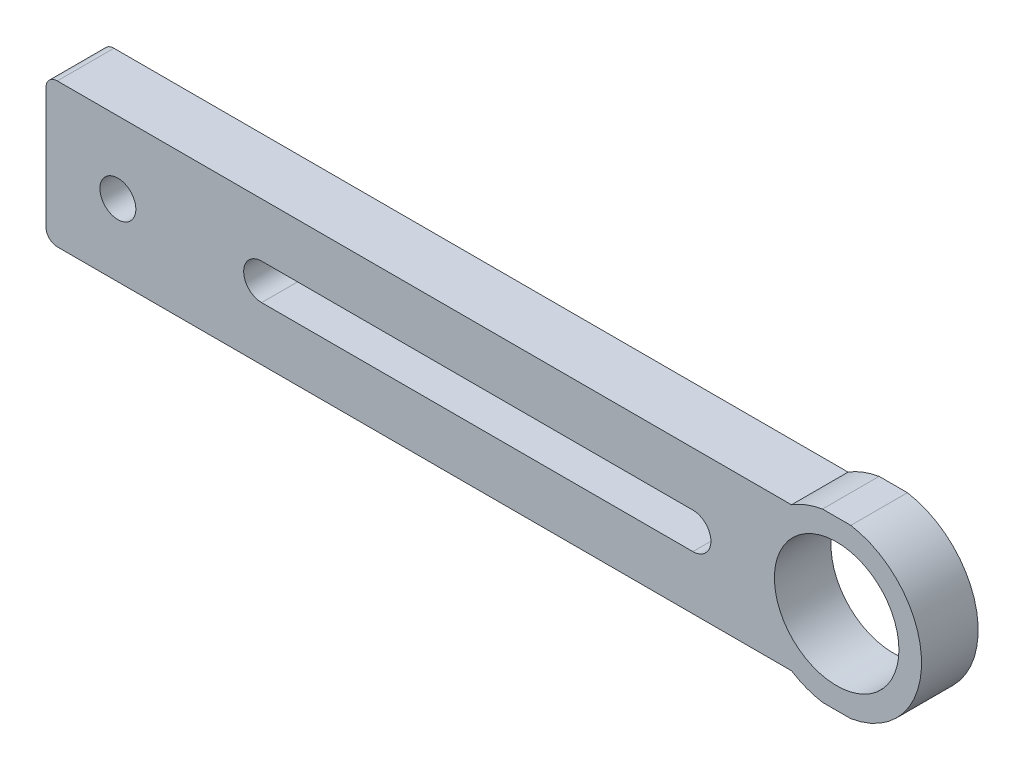
ISO-10303-21;
HEADER;
FILE_DESCRIPTION(('STEP AP214'),'2;1');
FILE_NAME('part.step','',(''),(''),'','','');
FILE_SCHEMA(('AUTOMOTIVE_DESIGN { 1 0 10303 214 1 1 1 1 }'));
ENDSEC;
DATA;
#1=APPLICATION_CONTEXT('core data for automotive mechanical design processes');
#2=APPLICATION_PROTOCOL_DEFINITION('international standard','automotive_design',2000,#1);
#3=PRODUCT_CONTEXT('',#1,'mechanical');
#4=PRODUCT('Part','Part','',(#3));
#5=PRODUCT_RELATED_PRODUCT_CATEGORY('part','',(#4));
#6=PRODUCT_DEFINITION_FORMATION('','',#4);
#7=PRODUCT_DEFINITION_CONTEXT('part definition',#1,'design');
#8=PRODUCT_DEFINITION('design','',#6,#7);
#9=PRODUCT_DEFINITION_SHAPE('','',#8);
#10=(LENGTH_UNIT() NAMED_UNIT(*) SI_UNIT(.MILLI.,.METRE.));
#11=(NAMED_UNIT(*) PLANE_ANGLE_UNIT() SI_UNIT($,.RADIAN.));
#12=(NAMED_UNIT(*) SI_UNIT($,.STERADIAN.) SOLID_ANGLE_UNIT());
#13=UNCERTAINTY_MEASURE_WITH_UNIT(LENGTH_MEASURE(1.E-05),#10,'distance_accuracy_value','');
#14=(GEOMETRIC_REPRESENTATION_CONTEXT(3) GLOBAL_UNCERTAINTY_ASSIGNED_CONTEXT((#13)) GLOBAL_UNIT_ASSIGNED_CONTEXT((#10,
#11,#12)) REPRESENTATION_CONTEXT('',''));
#15=CARTESIAN_POINT('',(0.,0.,0.));
#16=DIRECTION('',(0.,0.,1.));
#17=DIRECTION('',(1.,0.,0.));
#18=AXIS2_PLACEMENT_3D('',#15,#16,#17);
#19=CARTESIAN_POINT('',(69.85,0.,10.));
#20=DIRECTION('',(0.,0.,1.));
#21=DIRECTION('',(1.,0.,0.));
#22=AXIS2_PLACEMENT_3D('',#19,#20,#21);
#23=PLANE('',#22);
#24=CARTESIAN_POINT('',(-57.15,0.,10.));
#25=DIRECTION('',(0.,0.,1.));
#26=DIRECTION('',(1.,0.,0.));
#27=AXIS2_PLACEMENT_3D('',#24,#25,#26);
#28=CIRCLE('',#27,3.175);
#29=CARTESIAN_POINT('',(-53.975,0.,10.));
#30=VERTEX_POINT('',#29);
#31=EDGE_CURVE('E186',#30,#30,#28,.T.);
#32=ORIENTED_EDGE('',*,*,#31,.F.);
#33=EDGE_LOOP('',(#32));
#34=FACE_BOUND('',#33,.T.);
#35=DIRECTION('',(0.,-1.,0.));
#36=VECTOR('',#35,1.);
#37=CARTESIAN_POINT('',(-69.8500000000001,-12.7,10.));
#38=LINE('',#37,#36);
#39=CARTESIAN_POINT('',(-69.8500000000001,10.7,10.));
#40=VERTEX_POINT('',#39);
#41=CARTESIAN_POINT('',(-69.8500000000001,-10.7,10.));
#42=VERTEX_POINT('',#41);
#43=EDGE_CURVE('E207',#40,#42,#38,.T.);
#44=ORIENTED_EDGE('',*,*,#43,.T.);
#45=CARTESIAN_POINT('',(-67.8500000000001,-10.7,10.));
#46=DIRECTION('',(0.,0.,1.));
#47=DIRECTION('',(1.,0.,0.));
#48=AXIS2_PLACEMENT_3D('',#45,#46,#47);
#49=CIRCLE('',#48,2.);
#50=CARTESIAN_POINT('',(-67.8500000000001,-12.7,10.));
#51=VERTEX_POINT('',#50);
#52=EDGE_CURVE('E43',#42,#51,#49,.T.);
#53=ORIENTED_EDGE('',*,*,#52,.T.);
#54=DIRECTION('',(1.,0.,0.));
#55=VECTOR('',#54,1.);
#56=CARTESIAN_POINT('',(61.868145578877,-12.7,10.));
#57=LINE('',#56,#55);
#58=CARTESIAN_POINT('',(61.868145578877,-12.7,10.));
#59=VERTEX_POINT('',#58);
#60=EDGE_CURVE('E192',#51,#59,#57,.T.);
#61=ORIENTED_EDGE('',*,*,#60,.T.);
#62=CARTESIAN_POINT('',(69.85,0.,10.));
#63=DIRECTION('',(0.,0.,1.));
#64=DIRECTION('',(-1.,0.,0.));
#65=AXIS2_PLACEMENT_3D('',#62,#63,#64);
#66=CIRCLE('',#65,15.);
#67=CARTESIAN_POINT('',(67.35,-14.790199457749,10.));
#68=VERTEX_POINT('',#67);
#69=EDGE_CURVE('E194',#59,#68,#66,.T.);
#70=ORIENTED_EDGE('',*,*,#69,.T.);
#71=DIRECTION('',(1.,0.,0.));
#72=VECTOR('',#71,1.);
#73=CARTESIAN_POINT('',(67.35,-14.790199457749,10.));
#74=LINE('',#73,#72);
#75=CARTESIAN_POINT('',(72.35,-14.790199457749,10.));
#76=VERTEX_POINT('',#75);
#77=EDGE_CURVE('E197',#68,#76,#74,.T.);
#78=ORIENTED_EDGE('',*,*,#77,.T.);
#79=CARTESIAN_POINT('',(69.85,0.,10.));
#80=DIRECTION('',(0.,0.,1.));
#81=DIRECTION('',(1.,0.,0.));
#82=AXIS2_PLACEMENT_3D('',#79,#80,#81);
#83=CIRCLE('',#82,15.);
#84=CARTESIAN_POINT('',(72.35,14.7901994577491,10.));
#85=VERTEX_POINT('',#84);
#86=EDGE_CURVE('E199',#76,#85,#83,.T.);
#87=ORIENTED_EDGE('',*,*,#86,.T.);
#88=DIRECTION('',(-1.,0.,0.));
#89=VECTOR('',#88,1.);
#90=CARTESIAN_POINT('',(67.35,14.7901994577491,10.));
#91=LINE('',#90,#89);
#92=CARTESIAN_POINT('',(67.35,14.790199457749,10.));
#93=VERTEX_POINT('',#92);
#94=EDGE_CURVE('E201',#85,#93,#91,.T.);
#95=ORIENTED_EDGE('',*,*,#94,.T.);
#96=CARTESIAN_POINT('',(69.85,0.,10.));
#97=DIRECTION('',(0.,0.,1.));
#98=DIRECTION('',(1.,0.,0.));
#99=AXIS2_PLACEMENT_3D('',#96,#97,#98);
#100=CIRCLE('',#99,15.);
#101=CARTESIAN_POINT('',(61.868145578877,12.7,10.));
#102=VERTEX_POINT('',#101);
#103=EDGE_CURVE('E203',#93,#102,#100,.T.);
#104=ORIENTED_EDGE('',*,*,#103,.T.);
#105=DIRECTION('',(-1.,0.,0.));
#106=VECTOR('',#105,1.);
#107=CARTESIAN_POINT('',(61.868145578877,12.7,10.));
#108=LINE('',#107,#106);
#109=CARTESIAN_POINT('',(-67.8500000000001,12.7,10.));
#110=VERTEX_POINT('',#109);
#111=EDGE_CURVE('E205',#102,#110,#108,.T.);
#112=ORIENTED_EDGE('',*,*,#111,.T.);
#113=CARTESIAN_POINT('',(-67.8500000000001,10.7,10.));
#114=DIRECTION('',(0.,0.,1.));
#115=DIRECTION('',(1.,0.,0.));
#116=AXIS2_PLACEMENT_3D('',#113,#114,#115);
#117=CIRCLE('',#116,2.);
#118=EDGE_CURVE('E252',#110,#40,#117,.T.);
#119=ORIENTED_EDGE('',*,*,#118,.T.);
#120=EDGE_LOOP('',(#44,#53,#61,#70,#78,#87,#95,#104,#112,#119));
#121=FACE_BOUND('',#120,.T.);
#122=CARTESIAN_POINT('',(69.85,0.,10.));
#123=DIRECTION('',(0.,0.,1.));
#124=DIRECTION('',(1.,0.,0.));
#125=AXIS2_PLACEMENT_3D('',#122,#123,#124);
#126=CIRCLE('',#125,11.);
#127=CARTESIAN_POINT('',(80.85,0.,10.));
#128=VERTEX_POINT('',#127);
#129=EDGE_CURVE('E180',#128,#128,#126,.T.);
#130=ORIENTED_EDGE('',*,*,#129,.F.);
#131=EDGE_LOOP('',(#130));
#132=FACE_BOUND('',#131,.T.);
#133=DIRECTION('',(1.,0.,0.));
#134=VECTOR('',#133,1.);
#135=CARTESIAN_POINT('',(-31.75,-3.175,10.));
#136=LINE('',#135,#134);
#137=CARTESIAN_POINT('',(-31.75,-3.175,10.));
#138=VERTEX_POINT('',#137);
#139=CARTESIAN_POINT('',(44.45,-3.175,10.));
#140=VERTEX_POINT('',#139);
#141=EDGE_CURVE('E149',#138,#140,#136,.T.);
#142=ORIENTED_EDGE('',*,*,#141,.F.);
#143=CARTESIAN_POINT('',(-31.75,0.,10.));
#144=DIRECTION('',(0.,0.,1.));
#145=DIRECTION('',(1.,0.,0.));
#146=AXIS2_PLACEMENT_3D('',#143,#144,#145);
#147=CIRCLE('',#146,3.175);
#148=CARTESIAN_POINT('',(-31.75,3.175,10.));
#149=VERTEX_POINT('',#148);
#150=EDGE_CURVE('E139',#149,#138,#147,.T.);
#151=ORIENTED_EDGE('',*,*,#150,.F.);
#152=DIRECTION('',(-1.,0.,0.));
#153=VECTOR('',#152,1.);
#154=CARTESIAN_POINT('',(-31.75,3.175,10.));
#155=LINE('',#154,#153);
#156=CARTESIAN_POINT('',(44.45,3.175,10.));
#157=VERTEX_POINT('',#156);
#158=EDGE_CURVE('E164',#157,#149,#155,.T.);
#159=ORIENTED_EDGE('',*,*,#158,.F.);
#160=CARTESIAN_POINT('',(44.45,0.,10.));
#161=DIRECTION('',(0.,0.,1.));
#162=DIRECTION('',(1.,0.,0.));
#163=AXIS2_PLACEMENT_3D('',#160,#161,#162);
#164=CIRCLE('',#163,3.175);
#165=EDGE_CURVE('E162',#140,#157,#164,.T.);
#166=ORIENTED_EDGE('',*,*,#165,.F.);
#167=EDGE_LOOP('',(#142,#151,#159,#166));
#168=FACE_BOUND('',#167,.T.);
#169=ADVANCED_FACE('F35',(#34,#121,#132,#168),#23,.T.);
#170=CARTESIAN_POINT('',(69.85,0.,0.));
#171=DIRECTION('',(0.,0.,1.));
#172=DIRECTION('',(1.,0.,0.));
#173=AXIS2_PLACEMENT_3D('',#170,#171,#172);
#174=PLANE('',#173);
#175=CARTESIAN_POINT('',(69.85,0.,0.));
#176=DIRECTION('',(0.,0.,1.));
#177=DIRECTION('',(1.,0.,0.));
#178=AXIS2_PLACEMENT_3D('',#175,#176,#177);
#179=CIRCLE('',#178,11.);
#180=CARTESIAN_POINT('',(80.85,0.,0.));
#181=VERTEX_POINT('',#180);
#182=EDGE_CURVE('E157',#181,#181,#179,.T.);
#183=ORIENTED_EDGE('',*,*,#182,.T.);
#184=EDGE_LOOP('',(#183));
#185=FACE_BOUND('',#184,.T.);
#186=CARTESIAN_POINT('',(-57.15,0.,0.));
#187=DIRECTION('',(0.,0.,1.));
#188=DIRECTION('',(1.,0.,0.));
#189=AXIS2_PLACEMENT_3D('',#186,#187,#188);
#190=CIRCLE('',#189,3.175);
#191=CARTESIAN_POINT('',(-53.975,0.,0.));
#192=VERTEX_POINT('',#191);
#193=EDGE_CURVE('E183',#192,#192,#190,.T.);
#194=ORIENTED_EDGE('',*,*,#193,.T.);
#195=EDGE_LOOP('',(#194));
#196=FACE_BOUND('',#195,.T.);
#197=DIRECTION('',(1.,0.,0.));
#198=VECTOR('',#197,1.);
#199=CARTESIAN_POINT('',(61.868145578877,-12.7,0.));
#200=LINE('',#199,#198);
#201=CARTESIAN_POINT('',(-67.8500000000001,-12.7,0.));
#202=VERTEX_POINT('',#201);
#203=CARTESIAN_POINT('',(61.868145578877,-12.7,0.));
#204=VERTEX_POINT('',#203);
#205=EDGE_CURVE('E189',#202,#204,#200,.T.);
#206=ORIENTED_EDGE('',*,*,#205,.F.);
#207=CARTESIAN_POINT('',(-67.8500000000001,-10.7,0.));
#208=DIRECTION('',(0.,0.,1.));
#209=DIRECTION('',(1.,0.,0.));
#210=AXIS2_PLACEMENT_3D('',#207,#208,#209);
#211=CIRCLE('',#210,2.);
#212=CARTESIAN_POINT('',(-69.8500000000001,-10.7,0.));
#213=VERTEX_POINT('',#212);
#214=EDGE_CURVE('E246',#202,#213,#211,.F.);
#215=ORIENTED_EDGE('',*,*,#214,.T.);
#216=DIRECTION('',(0.,-1.,0.));
#217=VECTOR('',#216,1.);
#218=CARTESIAN_POINT('',(-69.8500000000001,-12.7,0.));
#219=LINE('',#218,#217);
#220=CARTESIAN_POINT('',(-69.8500000000001,10.7,0.));
#221=VERTEX_POINT('',#220);
#222=EDGE_CURVE('E195',#221,#213,#219,.T.);
#223=ORIENTED_EDGE('',*,*,#222,.F.);
#224=CARTESIAN_POINT('',(-67.8500000000001,10.7,0.));
#225=DIRECTION('',(0.,0.,1.));
#226=DIRECTION('',(1.,0.,0.));
#227=AXIS2_PLACEMENT_3D('',#224,#225,#226);
#228=CIRCLE('',#227,2.);
#229=CARTESIAN_POINT('',(-67.8500000000001,12.7,0.));
#230=VERTEX_POINT('',#229);
#231=EDGE_CURVE('E244',#221,#230,#228,.F.);
#232=ORIENTED_EDGE('',*,*,#231,.T.);
#233=DIRECTION('',(-1.,0.,0.));
#234=VECTOR('',#233,1.);
#235=CARTESIAN_POINT('',(61.868145578877,12.7,0.));
#236=LINE('',#235,#234);
#237=CARTESIAN_POINT('',(61.868145578877,12.7,0.));
#238=VERTEX_POINT('',#237);
#239=EDGE_CURVE('E221',#238,#230,#236,.T.);
#240=ORIENTED_EDGE('',*,*,#239,.F.);
#241=CARTESIAN_POINT('',(69.85,0.,0.));
#242=DIRECTION('',(0.,0.,1.));
#243=DIRECTION('',(1.,0.,0.));
#244=AXIS2_PLACEMENT_3D('',#241,#242,#243);
#245=CIRCLE('',#244,15.);
#246=CARTESIAN_POINT('',(67.35,14.790199457749,0.));
#247=VERTEX_POINT('',#246);
#248=EDGE_CURVE('E219',#247,#238,#245,.T.);
#249=ORIENTED_EDGE('',*,*,#248,.F.);
#250=DIRECTION('',(-1.,0.,0.));
#251=VECTOR('',#250,1.);
#252=CARTESIAN_POINT('',(67.35,14.7901994577491,0.));
#253=LINE('',#252,#251);
#254=CARTESIAN_POINT('',(72.35,14.7901994577491,0.));
#255=VERTEX_POINT('',#254);
#256=EDGE_CURVE('E217',#255,#247,#253,.T.);
#257=ORIENTED_EDGE('',*,*,#256,.F.);
#258=CARTESIAN_POINT('',(69.85,0.,0.));
#259=DIRECTION('',(0.,0.,1.));
#260=DIRECTION('',(1.,0.,0.));
#261=AXIS2_PLACEMENT_3D('',#258,#259,#260);
#262=CIRCLE('',#261,15.);
#263=CARTESIAN_POINT('',(72.35,-14.790199457749,0.));
#264=VERTEX_POINT('',#263);
#265=EDGE_CURVE('E215',#264,#255,#262,.T.);
#266=ORIENTED_EDGE('',*,*,#265,.F.);
#267=DIRECTION('',(1.,0.,0.));
#268=VECTOR('',#267,1.);
#269=CARTESIAN_POINT('',(67.35,-14.790199457749,0.));
#270=LINE('',#269,#268);
#271=CARTESIAN_POINT('',(67.35,-14.790199457749,0.));
#272=VERTEX_POINT('',#271);
#273=EDGE_CURVE('E213',#272,#264,#270,.T.);
#274=ORIENTED_EDGE('',*,*,#273,.F.);
#275=CARTESIAN_POINT('',(69.85,0.,0.));
#276=DIRECTION('',(0.,0.,1.));
#277=DIRECTION('',(-1.,0.,0.));
#278=AXIS2_PLACEMENT_3D('',#275,#276,#277);
#279=CIRCLE('',#278,15.);
#280=EDGE_CURVE('E211',#204,#272,#279,.T.);
#281=ORIENTED_EDGE('',*,*,#280,.F.);
#282=EDGE_LOOP('',(#206,#215,#223,#232,#240,#249,#257,#266,#274,#281));
#283=FACE_BOUND('',#282,.T.);
#284=CARTESIAN_POINT('',(-31.75,0.,0.));
#285=DIRECTION('',(0.,0.,1.));
#286=DIRECTION('',(1.,0.,0.));
#287=AXIS2_PLACEMENT_3D('',#284,#285,#286);
#288=CIRCLE('',#287,3.175);
#289=CARTESIAN_POINT('',(-31.75,3.175,0.));
#290=VERTEX_POINT('',#289);
#291=CARTESIAN_POINT('',(-31.75,-3.175,0.));
#292=VERTEX_POINT('',#291);
#293=EDGE_CURVE('E168',#290,#292,#288,.T.);
#294=ORIENTED_EDGE('',*,*,#293,.T.);
#295=DIRECTION('',(1.,0.,0.));
#296=VECTOR('',#295,1.);
#297=CARTESIAN_POINT('',(-31.75,-3.175,0.));
#298=LINE('',#297,#296);
#299=CARTESIAN_POINT('',(44.45,-3.175,0.));
#300=VERTEX_POINT('',#299);
#301=EDGE_CURVE('E156',#292,#300,#298,.T.);
#302=ORIENTED_EDGE('',*,*,#301,.T.);
#303=CARTESIAN_POINT('',(44.45,0.,0.));
#304=DIRECTION('',(0.,0.,1.));
#305=DIRECTION('',(1.,0.,0.));
#306=AXIS2_PLACEMENT_3D('',#303,#304,#305);
#307=CIRCLE('',#306,3.175);
#308=CARTESIAN_POINT('',(44.45,3.175,0.));
#309=VERTEX_POINT('',#308);
#310=EDGE_CURVE('E171',#300,#309,#307,.T.);
#311=ORIENTED_EDGE('',*,*,#310,.T.);
#312=DIRECTION('',(-1.,0.,0.));
#313=VECTOR('',#312,1.);
#314=CARTESIAN_POINT('',(-31.75,3.175,0.));
#315=LINE('',#314,#313);
#316=EDGE_CURVE('E150',#309,#290,#315,.T.);
#317=ORIENTED_EDGE('',*,*,#316,.T.);
#318=EDGE_LOOP('',(#294,#302,#311,#317));
#319=FACE_BOUND('',#318,.T.);
#320=ADVANCED_FACE('F267',(#185,#196,#283,#319),#174,.F.);
#321=CARTESIAN_POINT('',(61.868145578877,-12.7,10.));
#322=DIRECTION('',(0.,1.,0.));
#323=DIRECTION('',(-1.,0.,0.));
#324=AXIS2_PLACEMENT_3D('',#321,#322,#323);
#325=PLANE('',#324);
#326=ORIENTED_EDGE('',*,*,#60,.F.);
#327=DIRECTION('',(0.,0.,-1.));
#328=VECTOR('',#327,1.);
#329=CARTESIAN_POINT('',(-67.8500000000001,-12.7,10.));
#330=LINE('',#329,#328);
#331=EDGE_CURVE('E241',#51,#202,#330,.T.);
#332=ORIENTED_EDGE('',*,*,#331,.T.);
#333=ORIENTED_EDGE('',*,*,#205,.T.);
#334=DIRECTION('',(0.,0.,-1.));
#335=VECTOR('',#334,1.);
#336=CARTESIAN_POINT('',(61.868145578877,-12.7,10.));
#337=LINE('',#336,#335);
#338=EDGE_CURVE('E238',#59,#204,#337,.T.);
#339=ORIENTED_EDGE('',*,*,#338,.F.);
#340=EDGE_LOOP('',(#326,#332,#333,#339));
#341=FACE_BOUND('',#340,.T.);
#342=ADVANCED_FACE('F262',(#341),#325,.F.);
#343=CARTESIAN_POINT('',(69.85,0.,10.));
#344=DIRECTION('',(0.,0.,-1.));
#345=DIRECTION('',(-1.,0.,0.));
#346=AXIS2_PLACEMENT_3D('',#343,#344,#345);
#347=CYLINDRICAL_SURFACE('',#346,15.);
#348=ORIENTED_EDGE('',*,*,#280,.T.);
#349=DIRECTION('',(0.,0.,-1.));
#350=VECTOR('',#349,1.);
#351=CARTESIAN_POINT('',(67.35,-14.790199457749,10.));
#352=LINE('',#351,#350);
#353=EDGE_CURVE('E235',#68,#272,#352,.T.);
#354=ORIENTED_EDGE('',*,*,#353,.F.);
#355=ORIENTED_EDGE('',*,*,#69,.F.);
#356=ORIENTED_EDGE('',*,*,#338,.T.);
#357=EDGE_LOOP('',(#348,#354,#355,#356));
#358=FACE_BOUND('',#357,.T.);
#359=ADVANCED_FACE('F298',(#358),#347,.T.);
#360=CARTESIAN_POINT('',(67.35,-14.790199457749,10.));
#361=DIRECTION('',(0.,1.,0.));
#362=DIRECTION('',(0.,0.,1.));
#363=AXIS2_PLACEMENT_3D('',#360,#361,#362);
#364=PLANE('',#363);
#365=ORIENTED_EDGE('',*,*,#273,.T.);
#366=DIRECTION('',(0.,0.,-1.));
#367=VECTOR('',#366,1.);
#368=CARTESIAN_POINT('',(72.35,-14.790199457749,10.));
#369=LINE('',#368,#367);
#370=EDGE_CURVE('E232',#76,#264,#369,.T.);
#371=ORIENTED_EDGE('',*,*,#370,.F.);
#372=ORIENTED_EDGE('',*,*,#77,.F.);
#373=ORIENTED_EDGE('',*,*,#353,.T.);
#374=EDGE_LOOP('',(#365,#371,#372,#373));
#375=FACE_BOUND('',#374,.T.);
#376=ADVANCED_FACE('F295',(#375),#364,.F.);
#377=CARTESIAN_POINT('',(69.85,0.,10.));
#378=DIRECTION('',(0.,0.,-1.));
#379=DIRECTION('',(-1.,0.,0.));
#380=AXIS2_PLACEMENT_3D('',#377,#378,#379);
#381=CYLINDRICAL_SURFACE('',#380,15.);
#382=ORIENTED_EDGE('',*,*,#265,.T.);
#383=DIRECTION('',(0.,0.,-1.));
#384=VECTOR('',#383,1.);
#385=CARTESIAN_POINT('',(72.35,14.7901994577491,10.));
#386=LINE('',#385,#384);
#387=EDGE_CURVE('E229',#85,#255,#386,.T.);
#388=ORIENTED_EDGE('',*,*,#387,.F.);
#389=ORIENTED_EDGE('',*,*,#86,.F.);
#390=ORIENTED_EDGE('',*,*,#370,.T.);
#391=EDGE_LOOP('',(#382,#388,#389,#390));
#392=FACE_BOUND('',#391,.T.);
#393=ADVANCED_FACE('F291',(#392),#381,.T.);
#394=CARTESIAN_POINT('',(67.35,14.7901994577491,10.));
#395=DIRECTION('',(0.,-1.,0.));
#396=DIRECTION('',(0.,0.,-1.));
#397=AXIS2_PLACEMENT_3D('',#394,#395,#396);
#398=PLANE('',#397);
#399=ORIENTED_EDGE('',*,*,#256,.T.);
#400=DIRECTION('',(0.,0.,-1.));
#401=VECTOR('',#400,1.);
#402=CARTESIAN_POINT('',(67.35,14.790199457749,10.));
#403=LINE('',#402,#401);
#404=EDGE_CURVE('E226',#93,#247,#403,.T.);
#405=ORIENTED_EDGE('',*,*,#404,.F.);
#406=ORIENTED_EDGE('',*,*,#94,.F.);
#407=ORIENTED_EDGE('',*,*,#387,.T.);
#408=EDGE_LOOP('',(#399,#405,#406,#407));
#409=FACE_BOUND('',#408,.T.);
#410=ADVANCED_FACE('F286',(#409),#398,.F.);
#411=CARTESIAN_POINT('',(69.85,0.,10.));
#412=DIRECTION('',(0.,0.,-1.));
#413=DIRECTION('',(-1.,0.,0.));
#414=AXIS2_PLACEMENT_3D('',#411,#412,#413);
#415=CYLINDRICAL_SURFACE('',#414,15.);
#416=ORIENTED_EDGE('',*,*,#248,.T.);
#417=DIRECTION('',(0.,0.,-1.));
#418=VECTOR('',#417,1.);
#419=CARTESIAN_POINT('',(61.868145578877,12.7,10.));
#420=LINE('',#419,#418);
#421=EDGE_CURVE('E209',#102,#238,#420,.T.);
#422=ORIENTED_EDGE('',*,*,#421,.F.);
#423=ORIENTED_EDGE('',*,*,#103,.F.);
#424=ORIENTED_EDGE('',*,*,#404,.T.);
#425=EDGE_LOOP('',(#416,#422,#423,#424));
#426=FACE_BOUND('',#425,.T.);
#427=ADVANCED_FACE('F280',(#426),#415,.T.);
#428=CARTESIAN_POINT('',(61.868145578877,12.7,10.));
#429=DIRECTION('',(0.,-1.,0.));
#430=DIRECTION('',(1.,0.,0.));
#431=AXIS2_PLACEMENT_3D('',#428,#429,#430);
#432=PLANE('',#431);
#433=ORIENTED_EDGE('',*,*,#239,.T.);
#434=DIRECTION('',(0.,0.,-1.));
#435=VECTOR('',#434,1.);
#436=CARTESIAN_POINT('',(-67.8500000000001,12.7,10.));
#437=LINE('',#436,#435);
#438=EDGE_CURVE('E11',#230,#110,#437,.F.);
#439=ORIENTED_EDGE('',*,*,#438,.T.);
#440=ORIENTED_EDGE('',*,*,#111,.F.);
#441=ORIENTED_EDGE('',*,*,#421,.T.);
#442=EDGE_LOOP('',(#433,#439,#440,#441));
#443=FACE_BOUND('',#442,.T.);
#444=ADVANCED_FACE('F276',(#443),#432,.F.);
#445=CARTESIAN_POINT('',(-69.8500000000001,-12.7,10.));
#446=DIRECTION('',(1.,0.,0.));
#447=DIRECTION('',(0.,0.,-1.));
#448=AXIS2_PLACEMENT_3D('',#445,#446,#447);
#449=PLANE('',#448);
#450=ORIENTED_EDGE('',*,*,#222,.T.);
#451=DIRECTION('',(0.,0.,-1.));
#452=VECTOR('',#451,1.);
#453=CARTESIAN_POINT('',(-69.8500000000001,-10.7,10.));
#454=LINE('',#453,#452);
#455=EDGE_CURVE('E56',#213,#42,#454,.F.);
#456=ORIENTED_EDGE('',*,*,#455,.T.);
#457=ORIENTED_EDGE('',*,*,#43,.F.);
#458=DIRECTION('',(0.,0.,-1.));
#459=VECTOR('',#458,1.);
#460=CARTESIAN_POINT('',(-69.8500000000001,10.7,10.));
#461=LINE('',#460,#459);
#462=EDGE_CURVE('E248',#40,#221,#461,.T.);
#463=ORIENTED_EDGE('',*,*,#462,.T.);
#464=EDGE_LOOP('',(#450,#456,#457,#463));
#465=FACE_BOUND('',#464,.T.);
#466=ADVANCED_FACE('F270',(#465),#449,.F.);
#467=CARTESIAN_POINT('',(-57.15,0.,10.));
#468=DIRECTION('',(0.,0.,-1.));
#469=DIRECTION('',(-1.,0.,0.));
#470=AXIS2_PLACEMENT_3D('',#467,#468,#469);
#471=CYLINDRICAL_SURFACE('',#470,3.175);
#472=ORIENTED_EDGE('',*,*,#31,.T.);
#473=EDGE_LOOP('',(#472));
#474=FACE_BOUND('',#473,.T.);
#475=ORIENTED_EDGE('',*,*,#193,.F.);
#476=EDGE_LOOP('',(#475));
#477=FACE_BOUND('',#476,.T.);
#478=ADVANCED_FACE('F317',(#474,#477),#471,.F.);
#479=CARTESIAN_POINT('',(69.85,0.,10.));
#480=DIRECTION('',(0.,0.,-1.));
#481=DIRECTION('',(-1.,0.,0.));
#482=AXIS2_PLACEMENT_3D('',#479,#480,#481);
#483=CYLINDRICAL_SURFACE('',#482,11.);
#484=ORIENTED_EDGE('',*,*,#129,.T.);
#485=EDGE_LOOP('',(#484));
#486=FACE_BOUND('',#485,.T.);
#487=ORIENTED_EDGE('',*,*,#182,.F.);
#488=EDGE_LOOP('',(#487));
#489=FACE_BOUND('',#488,.T.);
#490=ADVANCED_FACE('F357',(#486,#489),#483,.F.);
#491=CARTESIAN_POINT('',(-31.75,0.,10.));
#492=DIRECTION('',(0.,0.,-1.));
#493=DIRECTION('',(-1.,0.,0.));
#494=AXIS2_PLACEMENT_3D('',#491,#492,#493);
#495=CYLINDRICAL_SURFACE('',#494,3.175);
#496=ORIENTED_EDGE('',*,*,#293,.F.);
#497=DIRECTION('',(0.,0.,-1.));
#498=VECTOR('',#497,1.);
#499=CARTESIAN_POINT('',(-31.75,3.175,10.));
#500=LINE('',#499,#498);
#501=EDGE_CURVE('E145',#149,#290,#500,.T.);
#502=ORIENTED_EDGE('',*,*,#501,.F.);
#503=ORIENTED_EDGE('',*,*,#150,.T.);
#504=DIRECTION('',(0.,0.,-1.));
#505=VECTOR('',#504,1.);
#506=CARTESIAN_POINT('',(-31.75,-3.175,10.));
#507=LINE('',#506,#505);
#508=EDGE_CURVE('E142',#138,#292,#507,.T.);
#509=ORIENTED_EDGE('',*,*,#508,.T.);
#510=EDGE_LOOP('',(#496,#502,#503,#509));
#511=FACE_BOUND('',#510,.T.);
#512=ADVANCED_FACE('F141',(#511),#495,.F.);
#513=CARTESIAN_POINT('',(-31.75,-3.175,10.));
#514=DIRECTION('',(0.,1.,0.));
#515=DIRECTION('',(0.,0.,1.));
#516=AXIS2_PLACEMENT_3D('',#513,#514,#515);
#517=PLANE('',#516);
#518=ORIENTED_EDGE('',*,*,#301,.F.);
#519=ORIENTED_EDGE('',*,*,#508,.F.);
#520=ORIENTED_EDGE('',*,*,#141,.T.);
#521=DIRECTION('',(0.,0.,-1.));
#522=VECTOR('',#521,1.);
#523=CARTESIAN_POINT('',(44.45,-3.175,10.));
#524=LINE('',#523,#522);
#525=EDGE_CURVE('E158',#140,#300,#524,.T.);
#526=ORIENTED_EDGE('',*,*,#525,.T.);
#527=EDGE_LOOP('',(#518,#519,#520,#526));
#528=FACE_BOUND('',#527,.T.);
#529=ADVANCED_FACE('F153',(#528),#517,.T.);
#530=CARTESIAN_POINT('',(44.45,0.,10.));
#531=DIRECTION('',(0.,0.,-1.));
#532=DIRECTION('',(-1.,0.,0.));
#533=AXIS2_PLACEMENT_3D('',#530,#531,#532);
#534=CYLINDRICAL_SURFACE('',#533,3.175);
#535=ORIENTED_EDGE('',*,*,#310,.F.);
#536=ORIENTED_EDGE('',*,*,#525,.F.);
#537=ORIENTED_EDGE('',*,*,#165,.T.);
#538=DIRECTION('',(0.,0.,-1.));
#539=VECTOR('',#538,1.);
#540=CARTESIAN_POINT('',(44.45,3.175,10.));
#541=LINE('',#540,#539);
#542=EDGE_CURVE('E177',#157,#309,#541,.T.);
#543=ORIENTED_EDGE('',*,*,#542,.T.);
#544=EDGE_LOOP('',(#535,#536,#537,#543));
#545=FACE_BOUND('',#544,.T.);
#546=ADVANCED_FACE('F376',(#545),#534,.F.);
#547=CARTESIAN_POINT('',(-31.75,3.175,10.));
#548=DIRECTION('',(0.,-1.,0.));
#549=DIRECTION('',(0.,0.,-1.));
#550=AXIS2_PLACEMENT_3D('',#547,#548,#549);
#551=PLANE('',#550);
#552=ORIENTED_EDGE('',*,*,#316,.F.);
#553=ORIENTED_EDGE('',*,*,#542,.F.);
#554=ORIENTED_EDGE('',*,*,#158,.T.);
#555=ORIENTED_EDGE('',*,*,#501,.T.);
#556=EDGE_LOOP('',(#552,#553,#554,#555));
#557=FACE_BOUND('',#556,.T.);
#558=ADVANCED_FACE('F383',(#557),#551,.T.);
#559=CARTESIAN_POINT('',(-67.8500000000001,-10.7,10.));
#560=DIRECTION('',(0.,0.,-1.));
#561=DIRECTION('',(-1.,0.,0.));
#562=AXIS2_PLACEMENT_3D('',#559,#560,#561);
#563=CYLINDRICAL_SURFACE('',#562,2.);
#564=ORIENTED_EDGE('',*,*,#52,.F.);
#565=ORIENTED_EDGE('',*,*,#455,.F.);
#566=ORIENTED_EDGE('',*,*,#214,.F.);
#567=ORIENTED_EDGE('',*,*,#331,.F.);
#568=EDGE_LOOP('',(#564,#565,#566,#567));
#569=FACE_BOUND('',#568,.T.);
#570=ADVANCED_FACE('F264',(#569),#563,.T.);
#571=CARTESIAN_POINT('',(-67.8500000000001,10.7,10.));
#572=DIRECTION('',(0.,0.,-1.));
#573=DIRECTION('',(-1.,0.,0.));
#574=AXIS2_PLACEMENT_3D('',#571,#572,#573);
#575=CYLINDRICAL_SURFACE('',#574,2.);
#576=ORIENTED_EDGE('',*,*,#118,.F.);
#577=ORIENTED_EDGE('',*,*,#438,.F.);
#578=ORIENTED_EDGE('',*,*,#231,.F.);
#579=ORIENTED_EDGE('',*,*,#462,.F.);
#580=EDGE_LOOP('',(#576,#577,#578,#579));
#581=FACE_BOUND('',#580,.T.);
#582=ADVANCED_FACE('F37',(#581),#575,.T.);
#583=CLOSED_SHELL('',(#169,#320,#342,#359,#376,#393,#410,#427,#444,#466,#478,#490,#512,#529,
#546,#558,#570,#582));
#584=MANIFOLD_SOLID_BREP('B2',#583);
#585=ADVANCED_BREP_SHAPE_REPRESENTATION('',(#18,#584),#14);
#586=SHAPE_DEFINITION_REPRESENTATION(#9,#585);
ENDSEC;
END-ISO-10303-21;
